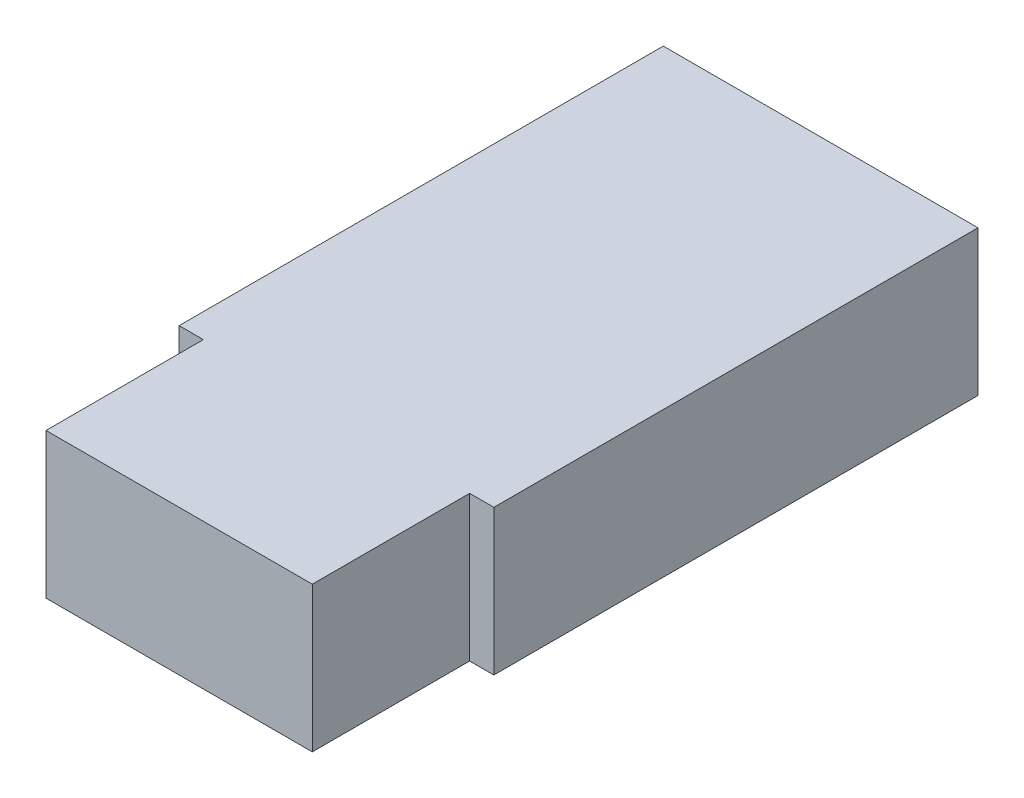
ISO-10303-21;
HEADER;
FILE_DESCRIPTION(('STEP AP214'),'2;1');
FILE_NAME('part.step','',(''),(''),'','','');
FILE_SCHEMA(('AUTOMOTIVE_DESIGN { 1 0 10303 214 1 1 1 1 }'));
ENDSEC;
DATA;
#1=APPLICATION_CONTEXT('core data for automotive mechanical design processes');
#2=APPLICATION_PROTOCOL_DEFINITION('international standard','automotive_design',2000,#1);
#3=PRODUCT_CONTEXT('',#1,'mechanical');
#4=PRODUCT('Part','Part','',(#3));
#5=PRODUCT_RELATED_PRODUCT_CATEGORY('part','',(#4));
#6=PRODUCT_DEFINITION_FORMATION('','',#4);
#7=PRODUCT_DEFINITION_CONTEXT('part definition',#1,'design');
#8=PRODUCT_DEFINITION('design','',#6,#7);
#9=PRODUCT_DEFINITION_SHAPE('','',#8);
#10=(LENGTH_UNIT() NAMED_UNIT(*) SI_UNIT(.MILLI.,.METRE.));
#11=(NAMED_UNIT(*) PLANE_ANGLE_UNIT() SI_UNIT($,.RADIAN.));
#12=(NAMED_UNIT(*) SI_UNIT($,.STERADIAN.) SOLID_ANGLE_UNIT());
#13=UNCERTAINTY_MEASURE_WITH_UNIT(LENGTH_MEASURE(1.E-05),#10,'distance_accuracy_value','');
#14=(GEOMETRIC_REPRESENTATION_CONTEXT(3) GLOBAL_UNCERTAINTY_ASSIGNED_CONTEXT((#13)) GLOBAL_UNIT_ASSIGNED_CONTEXT((#10,
#11,#12)) REPRESENTATION_CONTEXT('',''));
#15=CARTESIAN_POINT('',(0.,0.,0.));
#16=DIRECTION('',(0.,0.,1.));
#17=DIRECTION('',(1.,0.,0.));
#18=AXIS2_PLACEMENT_3D('',#15,#16,#17);
#19=CARTESIAN_POINT('',(13.,12.,-20.));
#20=DIRECTION('',(-1.,0.,0.));
#21=DIRECTION('',(0.,0.,1.));
#22=AXIS2_PLACEMENT_3D('',#19,#20,#21);
#23=PLANE('',#22);
#24=DIRECTION('',(0.,0.,-1.));
#25=VECTOR('',#24,1.);
#26=CARTESIAN_POINT('',(13.,0.,-20.));
#27=LINE('',#26,#25);
#28=CARTESIAN_POINT('',(13.,0.,20.));
#29=VERTEX_POINT('',#28);
#30=CARTESIAN_POINT('',(13.,0.,-20.));
#31=VERTEX_POINT('',#30);
#32=EDGE_CURVE('E129',#29,#31,#27,.T.);
#33=ORIENTED_EDGE('',*,*,#32,.T.);
#34=DIRECTION('',(0.,-1.,0.));
#35=VECTOR('',#34,1.);
#36=CARTESIAN_POINT('',(13.,12.,-20.));
#37=LINE('',#36,#35);
#38=CARTESIAN_POINT('',(13.,12.,-20.));
#39=VERTEX_POINT('',#38);
#40=EDGE_CURVE('E11',#39,#31,#37,.T.);
#41=ORIENTED_EDGE('',*,*,#40,.F.);
#42=DIRECTION('',(0.,0.,-1.));
#43=VECTOR('',#42,1.);
#44=CARTESIAN_POINT('',(13.,12.,-20.));
#45=LINE('',#44,#43);
#46=CARTESIAN_POINT('',(13.,12.,20.));
#47=VERTEX_POINT('',#46);
#48=EDGE_CURVE('E143',#47,#39,#45,.T.);
#49=ORIENTED_EDGE('',*,*,#48,.F.);
#50=DIRECTION('',(0.,-1.,0.));
#51=VECTOR('',#50,1.);
#52=CARTESIAN_POINT('',(13.,12.,20.));
#53=LINE('',#52,#51);
#54=EDGE_CURVE('E125',#47,#29,#53,.T.);
#55=ORIENTED_EDGE('',*,*,#54,.T.);
#56=EDGE_LOOP('',(#33,#41,#49,#55));
#57=FACE_BOUND('',#56,.T.);
#58=ADVANCED_FACE('F33',(#57),#23,.F.);
#59=CARTESIAN_POINT('',(-13.,12.,-20.));
#60=DIRECTION('',(0.,0.,1.));
#61=DIRECTION('',(1.,0.,0.));
#62=AXIS2_PLACEMENT_3D('',#59,#60,#61);
#63=PLANE('',#62);
#64=DIRECTION('',(-1.,0.,0.));
#65=VECTOR('',#64,1.);
#66=CARTESIAN_POINT('',(-13.,0.,-20.));
#67=LINE('',#66,#65);
#68=CARTESIAN_POINT('',(-13.,0.,-20.));
#69=VERTEX_POINT('',#68);
#70=EDGE_CURVE('E132',#31,#69,#67,.T.);
#71=ORIENTED_EDGE('',*,*,#70,.T.);
#72=DIRECTION('',(0.,-1.,0.));
#73=VECTOR('',#72,1.);
#74=CARTESIAN_POINT('',(-13.,12.,-20.));
#75=LINE('',#74,#73);
#76=CARTESIAN_POINT('',(-13.,12.,-20.));
#77=VERTEX_POINT('',#76);
#78=EDGE_CURVE('E41',#77,#69,#75,.T.);
#79=ORIENTED_EDGE('',*,*,#78,.F.);
#80=DIRECTION('',(-1.,0.,0.));
#81=VECTOR('',#80,1.);
#82=CARTESIAN_POINT('',(-13.,12.,-20.));
#83=LINE('',#82,#81);
#84=EDGE_CURVE('E92',#39,#77,#83,.T.);
#85=ORIENTED_EDGE('',*,*,#84,.F.);
#86=ORIENTED_EDGE('',*,*,#40,.T.);
#87=EDGE_LOOP('',(#71,#79,#85,#86));
#88=FACE_BOUND('',#87,.T.);
#89=ADVANCED_FACE('F178',(#88),#63,.F.);
#90=CARTESIAN_POINT('',(-13.,12.,-20.));
#91=DIRECTION('',(1.,0.,0.));
#92=DIRECTION('',(0.,0.,-1.));
#93=AXIS2_PLACEMENT_3D('',#90,#91,#92);
#94=PLANE('',#93);
#95=DIRECTION('',(0.,0.,1.));
#96=VECTOR('',#95,1.);
#97=CARTESIAN_POINT('',(-13.,0.,-20.));
#98=LINE('',#97,#96);
#99=CARTESIAN_POINT('',(-13.,0.,20.));
#100=VERTEX_POINT('',#99);
#101=EDGE_CURVE('E134',#69,#100,#98,.T.);
#102=ORIENTED_EDGE('',*,*,#101,.T.);
#103=DIRECTION('',(0.,-1.,0.));
#104=VECTOR('',#103,1.);
#105=CARTESIAN_POINT('',(-13.,12.,20.));
#106=LINE('',#105,#104);
#107=CARTESIAN_POINT('',(-13.,12.,20.));
#108=VERTEX_POINT('',#107);
#109=EDGE_CURVE('E150',#108,#100,#106,.T.);
#110=ORIENTED_EDGE('',*,*,#109,.F.);
#111=DIRECTION('',(0.,0.,1.));
#112=VECTOR('',#111,1.);
#113=CARTESIAN_POINT('',(-13.,12.,-20.));
#114=LINE('',#113,#112);
#115=EDGE_CURVE('E158',#77,#108,#114,.T.);
#116=ORIENTED_EDGE('',*,*,#115,.F.);
#117=ORIENTED_EDGE('',*,*,#78,.T.);
#118=EDGE_LOOP('',(#102,#110,#116,#117));
#119=FACE_BOUND('',#118,.T.);
#120=ADVANCED_FACE('F156',(#119),#94,.F.);
#121=CARTESIAN_POINT('',(-13.,12.,20.));
#122=DIRECTION('',(0.,0.,-1.));
#123=DIRECTION('',(-1.,0.,0.));
#124=AXIS2_PLACEMENT_3D('',#121,#122,#123);
#125=PLANE('',#124);
#126=DIRECTION('',(1.,0.,0.));
#127=VECTOR('',#126,1.);
#128=CARTESIAN_POINT('',(-13.,0.,20.));
#129=LINE('',#128,#127);
#130=CARTESIAN_POINT('',(-11.,0.,20.));
#131=VERTEX_POINT('',#130);
#132=EDGE_CURVE('E136',#100,#131,#129,.T.);
#133=ORIENTED_EDGE('',*,*,#132,.T.);
#134=DIRECTION('',(0.,-1.,0.));
#135=VECTOR('',#134,1.);
#136=CARTESIAN_POINT('',(-11.,12.,20.));
#137=LINE('',#136,#135);
#138=CARTESIAN_POINT('',(-11.,12.,20.));
#139=VERTEX_POINT('',#138);
#140=EDGE_CURVE('E147',#139,#131,#137,.T.);
#141=ORIENTED_EDGE('',*,*,#140,.F.);
#142=DIRECTION('',(1.,0.,0.));
#143=VECTOR('',#142,1.);
#144=CARTESIAN_POINT('',(-13.,12.,20.));
#145=LINE('',#144,#143);
#146=EDGE_CURVE('E170',#108,#139,#145,.T.);
#147=ORIENTED_EDGE('',*,*,#146,.F.);
#148=ORIENTED_EDGE('',*,*,#109,.T.);
#149=EDGE_LOOP('',(#133,#141,#147,#148));
#150=FACE_BOUND('',#149,.T.);
#151=ADVANCED_FACE('F166',(#150),#125,.F.);
#152=CARTESIAN_POINT('',(-11.,12.,20.));
#153=DIRECTION('',(1.,0.,0.));
#154=DIRECTION('',(0.,0.,-1.));
#155=AXIS2_PLACEMENT_3D('',#152,#153,#154);
#156=PLANE('',#155);
#157=DIRECTION('',(0.,0.,1.));
#158=VECTOR('',#157,1.);
#159=CARTESIAN_POINT('',(-11.,0.,20.));
#160=LINE('',#159,#158);
#161=CARTESIAN_POINT('',(-11.,0.,33.));
#162=VERTEX_POINT('',#161);
#163=EDGE_CURVE('E138',#131,#162,#160,.T.);
#164=ORIENTED_EDGE('',*,*,#163,.T.);
#165=DIRECTION('',(0.,-1.,0.));
#166=VECTOR('',#165,1.);
#167=CARTESIAN_POINT('',(-11.,12.,33.));
#168=LINE('',#167,#166);
#169=CARTESIAN_POINT('',(-11.,12.,33.));
#170=VERTEX_POINT('',#169);
#171=EDGE_CURVE('E120',#170,#162,#168,.T.);
#172=ORIENTED_EDGE('',*,*,#171,.F.);
#173=DIRECTION('',(0.,0.,1.));
#174=VECTOR('',#173,1.);
#175=CARTESIAN_POINT('',(-11.,12.,20.));
#176=LINE('',#175,#174);
#177=EDGE_CURVE('E111',#139,#170,#176,.T.);
#178=ORIENTED_EDGE('',*,*,#177,.F.);
#179=ORIENTED_EDGE('',*,*,#140,.T.);
#180=EDGE_LOOP('',(#164,#172,#178,#179));
#181=FACE_BOUND('',#180,.T.);
#182=ADVANCED_FACE('F169',(#181),#156,.F.);
#183=CARTESIAN_POINT('',(11.,12.,33.));
#184=DIRECTION('',(0.,0.,-1.));
#185=DIRECTION('',(-1.,0.,0.));
#186=AXIS2_PLACEMENT_3D('',#183,#184,#185);
#187=PLANE('',#186);
#188=DIRECTION('',(1.,0.,0.));
#189=VECTOR('',#188,1.);
#190=CARTESIAN_POINT('',(11.,0.,33.));
#191=LINE('',#190,#189);
#192=CARTESIAN_POINT('',(11.,0.,33.));
#193=VERTEX_POINT('',#192);
#194=EDGE_CURVE('E119',#162,#193,#191,.T.);
#195=ORIENTED_EDGE('',*,*,#194,.T.);
#196=DIRECTION('',(0.,-1.,0.));
#197=VECTOR('',#196,1.);
#198=CARTESIAN_POINT('',(11.,12.,33.));
#199=LINE('',#198,#197);
#200=CARTESIAN_POINT('',(11.,12.,33.));
#201=VERTEX_POINT('',#200);
#202=EDGE_CURVE('E116',#201,#193,#199,.T.);
#203=ORIENTED_EDGE('',*,*,#202,.F.);
#204=DIRECTION('',(1.,0.,0.));
#205=VECTOR('',#204,1.);
#206=CARTESIAN_POINT('',(11.,12.,33.));
#207=LINE('',#206,#205);
#208=EDGE_CURVE('E105',#170,#201,#207,.T.);
#209=ORIENTED_EDGE('',*,*,#208,.F.);
#210=ORIENTED_EDGE('',*,*,#171,.T.);
#211=EDGE_LOOP('',(#195,#203,#209,#210));
#212=FACE_BOUND('',#211,.T.);
#213=ADVANCED_FACE('F117',(#212),#187,.F.);
#214=CARTESIAN_POINT('',(11.,12.,20.));
#215=DIRECTION('',(-1.,0.,0.));
#216=DIRECTION('',(0.,0.,1.));
#217=AXIS2_PLACEMENT_3D('',#214,#215,#216);
#218=PLANE('',#217);
#219=DIRECTION('',(0.,0.,-1.));
#220=VECTOR('',#219,1.);
#221=CARTESIAN_POINT('',(11.,0.,20.));
#222=LINE('',#221,#220);
#223=CARTESIAN_POINT('',(11.,0.,20.));
#224=VERTEX_POINT('',#223);
#225=EDGE_CURVE('E78',#193,#224,#222,.T.);
#226=ORIENTED_EDGE('',*,*,#225,.T.);
#227=DIRECTION('',(0.,-1.,0.));
#228=VECTOR('',#227,1.);
#229=CARTESIAN_POINT('',(11.,12.,20.));
#230=LINE('',#229,#228);
#231=CARTESIAN_POINT('',(11.,12.,20.));
#232=VERTEX_POINT('',#231);
#233=EDGE_CURVE('E121',#232,#224,#230,.T.);
#234=ORIENTED_EDGE('',*,*,#233,.F.);
#235=DIRECTION('',(0.,0.,-1.));
#236=VECTOR('',#235,1.);
#237=CARTESIAN_POINT('',(11.,12.,20.));
#238=LINE('',#237,#236);
#239=EDGE_CURVE('E109',#201,#232,#238,.T.);
#240=ORIENTED_EDGE('',*,*,#239,.F.);
#241=ORIENTED_EDGE('',*,*,#202,.T.);
#242=EDGE_LOOP('',(#226,#234,#240,#241));
#243=FACE_BOUND('',#242,.T.);
#244=ADVANCED_FACE('F123',(#243),#218,.F.);
#245=CARTESIAN_POINT('',(11.,12.,20.));
#246=DIRECTION('',(0.,0.,-1.));
#247=DIRECTION('',(-1.,0.,0.));
#248=AXIS2_PLACEMENT_3D('',#245,#246,#247);
#249=PLANE('',#248);
#250=DIRECTION('',(1.,0.,0.));
#251=VECTOR('',#250,1.);
#252=CARTESIAN_POINT('',(11.,0.,20.));
#253=LINE('',#252,#251);
#254=EDGE_CURVE('E84',#224,#29,#253,.T.);
#255=ORIENTED_EDGE('',*,*,#254,.T.);
#256=ORIENTED_EDGE('',*,*,#54,.F.);
#257=DIRECTION('',(1.,0.,0.));
#258=VECTOR('',#257,1.);
#259=CARTESIAN_POINT('',(11.,12.,20.));
#260=LINE('',#259,#258);
#261=EDGE_CURVE('E49',#232,#47,#260,.T.);
#262=ORIENTED_EDGE('',*,*,#261,.F.);
#263=ORIENTED_EDGE('',*,*,#233,.T.);
#264=EDGE_LOOP('',(#255,#256,#262,#263));
#265=FACE_BOUND('',#264,.T.);
#266=ADVANCED_FACE('F194',(#265),#249,.F.);
#267=CARTESIAN_POINT('',(0.,12.,0.));
#268=DIRECTION('',(0.,1.,0.));
#269=DIRECTION('',(0.,0.,1.));
#270=AXIS2_PLACEMENT_3D('',#267,#268,#269);
#271=PLANE('',#270);
#272=ORIENTED_EDGE('',*,*,#48,.T.);
#273=ORIENTED_EDGE('',*,*,#84,.T.);
#274=ORIENTED_EDGE('',*,*,#115,.T.);
#275=ORIENTED_EDGE('',*,*,#146,.T.);
#276=ORIENTED_EDGE('',*,*,#177,.T.);
#277=ORIENTED_EDGE('',*,*,#208,.T.);
#278=ORIENTED_EDGE('',*,*,#239,.T.);
#279=ORIENTED_EDGE('',*,*,#261,.T.);
#280=EDGE_LOOP('',(#272,#273,#274,#275,#276,#277,#278,#279));
#281=FACE_BOUND('',#280,.T.);
#282=ADVANCED_FACE('F107',(#281),#271,.T.);
#283=CARTESIAN_POINT('',(0.,0.,0.));
#284=DIRECTION('',(0.,1.,0.));
#285=DIRECTION('',(0.,0.,1.));
#286=AXIS2_PLACEMENT_3D('',#283,#284,#285);
#287=PLANE('',#286);
#288=ORIENTED_EDGE('',*,*,#32,.F.);
#289=ORIENTED_EDGE('',*,*,#254,.F.);
#290=ORIENTED_EDGE('',*,*,#225,.F.);
#291=ORIENTED_EDGE('',*,*,#194,.F.);
#292=ORIENTED_EDGE('',*,*,#163,.F.);
#293=ORIENTED_EDGE('',*,*,#132,.F.);
#294=ORIENTED_EDGE('',*,*,#101,.F.);
#295=ORIENTED_EDGE('',*,*,#70,.F.);
#296=EDGE_LOOP('',(#288,#289,#290,#291,#292,#293,#294,#295));
#297=FACE_BOUND('',#296,.T.);
#298=ADVANCED_FACE('F162',(#297),#287,.F.);
#299=CLOSED_SHELL('',(#58,#89,#120,#151,#182,#213,#244,#266,#282,#298));
#300=MANIFOLD_SOLID_BREP('B2',#299);
#301=ADVANCED_BREP_SHAPE_REPRESENTATION('',(#18,#300),#14);
#302=SHAPE_DEFINITION_REPRESENTATION(#9,#301);
ENDSEC;
END-ISO-10303-21;
